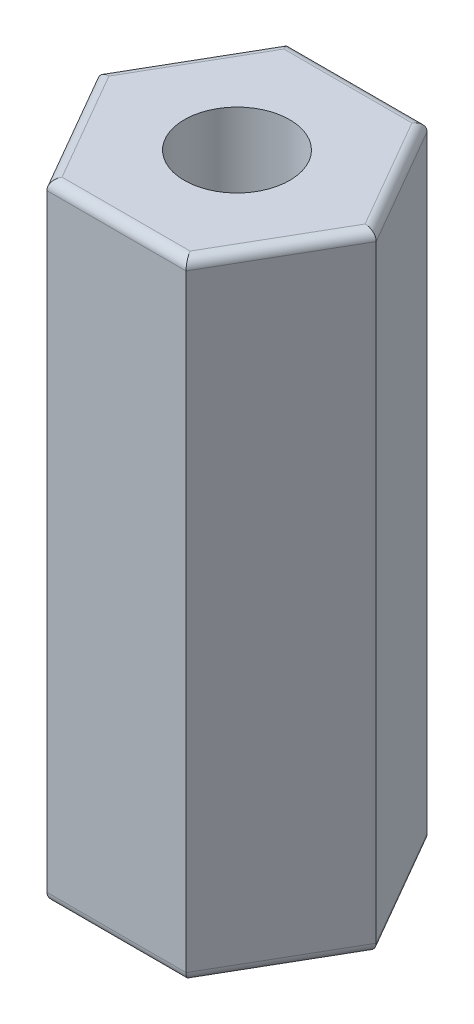
ISO-10303-21;
HEADER;
FILE_DESCRIPTION(('STEP AP214'),'2;1');
FILE_NAME('part.step','',(''),(''),'','','');
FILE_SCHEMA(('AUTOMOTIVE_DESIGN { 1 0 10303 214 1 1 1 1 }'));
ENDSEC;
DATA;
#1=APPLICATION_CONTEXT('core data for automotive mechanical design processes');
#2=APPLICATION_PROTOCOL_DEFINITION('international standard','automotive_design',2000,#1);
#3=PRODUCT_CONTEXT('',#1,'mechanical');
#4=PRODUCT('Part','Part','',(#3));
#5=PRODUCT_RELATED_PRODUCT_CATEGORY('part','',(#4));
#6=PRODUCT_DEFINITION_FORMATION('','',#4);
#7=PRODUCT_DEFINITION_CONTEXT('part definition',#1,'design');
#8=PRODUCT_DEFINITION('design','',#6,#7);
#9=PRODUCT_DEFINITION_SHAPE('','',#8);
#10=(LENGTH_UNIT() NAMED_UNIT(*) SI_UNIT(.MILLI.,.METRE.));
#11=(NAMED_UNIT(*) PLANE_ANGLE_UNIT() SI_UNIT($,.RADIAN.));
#12=(NAMED_UNIT(*) SI_UNIT($,.STERADIAN.) SOLID_ANGLE_UNIT());
#13=UNCERTAINTY_MEASURE_WITH_UNIT(LENGTH_MEASURE(1.E-05),#10,'distance_accuracy_value','');
#14=(GEOMETRIC_REPRESENTATION_CONTEXT(3) GLOBAL_UNCERTAINTY_ASSIGNED_CONTEXT((#13)) GLOBAL_UNIT_ASSIGNED_CONTEXT((#10,
#11,#12)) REPRESENTATION_CONTEXT('',''));
#15=CARTESIAN_POINT('',(0.,0.,0.));
#16=DIRECTION('',(0.,0.,1.));
#17=DIRECTION('',(1.,0.,0.));
#18=AXIS2_PLACEMENT_3D('',#15,#16,#17);
#19=CARTESIAN_POINT('',(1.44337567297406,13.,2.5));
#20=DIRECTION('',(-0.866025403784439,0.,-0.5));
#21=DIRECTION('',(-0.5,0.,0.866025403784439));
#22=AXIS2_PLACEMENT_3D('',#19,#20,#21);
#23=PLANE('',#22);
#24=DIRECTION('',(0.,-1.,0.));
#25=VECTOR('',#24,1.);
#26=CARTESIAN_POINT('',(2.88675134594813,13.,0.));
#27=LINE('',#26,#25);
#28=CARTESIAN_POINT('',(2.88675134594813,12.8,0.));
#29=VERTEX_POINT('',#28);
#30=CARTESIAN_POINT('',(2.88675134594813,0.199999999999999,0.));
#31=VERTEX_POINT('',#30);
#32=EDGE_CURVE('E149',#29,#31,#27,.T.);
#33=ORIENTED_EDGE('',*,*,#32,.F.);
#34=DIRECTION('',(0.5,0.,-0.866025403784439));
#35=VECTOR('',#34,1.);
#36=CARTESIAN_POINT('',(1.44337567297406,12.8,2.5));
#37=LINE('',#36,#35);
#38=CARTESIAN_POINT('',(1.44337567297406,12.8,2.5));
#39=VERTEX_POINT('',#38);
#40=EDGE_CURVE('E140',#29,#39,#37,.F.);
#41=ORIENTED_EDGE('',*,*,#40,.T.);
#42=DIRECTION('',(0.,-1.,0.));
#43=VECTOR('',#42,1.);
#44=CARTESIAN_POINT('',(1.44337567297406,13.,2.5));
#45=LINE('',#44,#43);
#46=CARTESIAN_POINT('',(1.44337567297406,0.200000000000001,2.5));
#47=VERTEX_POINT('',#46);
#48=EDGE_CURVE('E206',#39,#47,#45,.T.);
#49=ORIENTED_EDGE('',*,*,#48,.T.);
#50=DIRECTION('',(0.5,0.,-0.866025403784439));
#51=VECTOR('',#50,1.);
#52=CARTESIAN_POINT('',(1.44337567297406,0.200000000000001,2.5));
#53=LINE('',#52,#51);
#54=EDGE_CURVE('E181',#47,#31,#53,.T.);
#55=ORIENTED_EDGE('',*,*,#54,.T.);
#56=EDGE_LOOP('',(#33,#41,#49,#55));
#57=FACE_BOUND('',#56,.T.);
#58=ADVANCED_FACE('F33',(#57),#23,.F.);
#59=CARTESIAN_POINT('',(2.88675134594813,13.,0.));
#60=DIRECTION('',(-0.866025403784439,0.,0.5));
#61=DIRECTION('',(0.5,0.,0.866025403784439));
#62=AXIS2_PLACEMENT_3D('',#59,#60,#61);
#63=PLANE('',#62);
#64=DIRECTION('',(0.,-1.,0.));
#65=VECTOR('',#64,1.);
#66=CARTESIAN_POINT('',(1.44337567297406,13.,-2.5));
#67=LINE('',#66,#65);
#68=CARTESIAN_POINT('',(1.44337567297406,12.8,-2.5));
#69=VERTEX_POINT('',#68);
#70=CARTESIAN_POINT('',(1.44337567297406,0.199999999999999,-2.5));
#71=VERTEX_POINT('',#70);
#72=EDGE_CURVE('E152',#69,#71,#67,.T.);
#73=ORIENTED_EDGE('',*,*,#72,.F.);
#74=DIRECTION('',(-0.5,0.,-0.866025403784439));
#75=VECTOR('',#74,1.);
#76=CARTESIAN_POINT('',(2.88675134594813,12.8,0.));
#77=LINE('',#76,#75);
#78=EDGE_CURVE('E186',#69,#29,#77,.F.);
#79=ORIENTED_EDGE('',*,*,#78,.T.);
#80=ORIENTED_EDGE('',*,*,#32,.T.);
#81=DIRECTION('',(-0.5,0.,-0.866025403784439));
#82=VECTOR('',#81,1.);
#83=CARTESIAN_POINT('',(2.88675134594813,0.200000000000001,0.));
#84=LINE('',#83,#82);
#85=EDGE_CURVE('E184',#31,#71,#84,.T.);
#86=ORIENTED_EDGE('',*,*,#85,.T.);
#87=EDGE_LOOP('',(#73,#79,#80,#86));
#88=FACE_BOUND('',#87,.T.);
#89=ADVANCED_FACE('F268',(#88),#63,.F.);
#90=CARTESIAN_POINT('',(1.44337567297406,13.,-2.5));
#91=DIRECTION('',(0.,0.,1.));
#92=DIRECTION('',(1.,0.,0.));
#93=AXIS2_PLACEMENT_3D('',#90,#91,#92);
#94=PLANE('',#93);
#95=DIRECTION('',(0.,-1.,0.));
#96=VECTOR('',#95,1.);
#97=CARTESIAN_POINT('',(-1.44337567297406,13.,-2.5));
#98=LINE('',#97,#96);
#99=CARTESIAN_POINT('',(-1.44337567297406,12.8,-2.5));
#100=VERTEX_POINT('',#99);
#101=CARTESIAN_POINT('',(-1.44337567297406,0.199999999999999,-2.5));
#102=VERTEX_POINT('',#101);
#103=EDGE_CURVE('E259',#100,#102,#98,.T.);
#104=ORIENTED_EDGE('',*,*,#103,.F.);
#105=DIRECTION('',(-1.,0.,0.));
#106=VECTOR('',#105,1.);
#107=CARTESIAN_POINT('',(1.44337567297406,12.8,-2.5));
#108=LINE('',#107,#106);
#109=EDGE_CURVE('E165',#100,#69,#108,.F.);
#110=ORIENTED_EDGE('',*,*,#109,.T.);
#111=ORIENTED_EDGE('',*,*,#72,.T.);
#112=DIRECTION('',(-1.,0.,0.));
#113=VECTOR('',#112,1.);
#114=CARTESIAN_POINT('',(1.44337567297406,0.200000000000001,-2.5));
#115=LINE('',#114,#113);
#116=EDGE_CURVE('E163',#71,#102,#115,.T.);
#117=ORIENTED_EDGE('',*,*,#116,.T.);
#118=EDGE_LOOP('',(#104,#110,#111,#117));
#119=FACE_BOUND('',#118,.T.);
#120=ADVANCED_FACE('F265',(#119),#94,.F.);
#121=CARTESIAN_POINT('',(-1.44337567297406,13.,-2.5));
#122=DIRECTION('',(0.866025403784439,0.,0.5));
#123=DIRECTION('',(0.5,0.,-0.866025403784439));
#124=AXIS2_PLACEMENT_3D('',#121,#122,#123);
#125=PLANE('',#124);
#126=DIRECTION('',(0.,-1.,0.));
#127=VECTOR('',#126,1.);
#128=CARTESIAN_POINT('',(-2.88675134594813,13.,0.));
#129=LINE('',#128,#127);
#130=CARTESIAN_POINT('',(-2.88675134594813,12.8,0.));
#131=VERTEX_POINT('',#130);
#132=CARTESIAN_POINT('',(-2.88675134594813,0.199999999999999,0.));
#133=VERTEX_POINT('',#132);
#134=EDGE_CURVE('E251',#131,#133,#129,.T.);
#135=ORIENTED_EDGE('',*,*,#134,.F.);
#136=DIRECTION('',(-0.5,0.,0.866025403784439));
#137=VECTOR('',#136,1.);
#138=CARTESIAN_POINT('',(-1.44337567297406,12.8,-2.5));
#139=LINE('',#138,#137);
#140=EDGE_CURVE('E170',#131,#100,#139,.F.);
#141=ORIENTED_EDGE('',*,*,#140,.T.);
#142=ORIENTED_EDGE('',*,*,#103,.T.);
#143=DIRECTION('',(-0.5,0.,0.866025403784439));
#144=VECTOR('',#143,1.);
#145=CARTESIAN_POINT('',(-1.44337567297406,0.200000000000001,-2.5));
#146=LINE('',#145,#144);
#147=EDGE_CURVE('E168',#102,#133,#146,.T.);
#148=ORIENTED_EDGE('',*,*,#147,.T.);
#149=EDGE_LOOP('',(#135,#141,#142,#148));
#150=FACE_BOUND('',#149,.T.);
#151=ADVANCED_FACE('F275',(#150),#125,.F.);
#152=CARTESIAN_POINT('',(-2.88675134594813,13.,0.));
#153=DIRECTION('',(0.866025403784439,0.,-0.5));
#154=DIRECTION('',(-0.5,0.,-0.866025403784439));
#155=AXIS2_PLACEMENT_3D('',#152,#153,#154);
#156=PLANE('',#155);
#157=DIRECTION('',(0.,-1.,0.));
#158=VECTOR('',#157,1.);
#159=CARTESIAN_POINT('',(-1.44337567297406,13.,2.5));
#160=LINE('',#159,#158);
#161=CARTESIAN_POINT('',(-1.44337567297406,12.8,2.5));
#162=VERTEX_POINT('',#161);
#163=CARTESIAN_POINT('',(-1.44337567297406,0.199999999999999,2.5));
#164=VERTEX_POINT('',#163);
#165=EDGE_CURVE('E247',#162,#164,#160,.T.);
#166=ORIENTED_EDGE('',*,*,#165,.F.);
#167=DIRECTION('',(0.5,0.,0.866025403784439));
#168=VECTOR('',#167,1.);
#169=CARTESIAN_POINT('',(-2.88675134594813,12.8,0.));
#170=LINE('',#169,#168);
#171=EDGE_CURVE('E174',#162,#131,#170,.F.);
#172=ORIENTED_EDGE('',*,*,#171,.T.);
#173=ORIENTED_EDGE('',*,*,#134,.T.);
#174=DIRECTION('',(0.5,0.,0.866025403784439));
#175=VECTOR('',#174,1.);
#176=CARTESIAN_POINT('',(-2.88675134594813,0.200000000000001,0.));
#177=LINE('',#176,#175);
#178=EDGE_CURVE('E172',#133,#164,#177,.T.);
#179=ORIENTED_EDGE('',*,*,#178,.T.);
#180=EDGE_LOOP('',(#166,#172,#173,#179));
#181=FACE_BOUND('',#180,.T.);
#182=ADVANCED_FACE('F364',(#181),#156,.F.);
#183=CARTESIAN_POINT('',(-1.44337567297406,13.,2.5));
#184=DIRECTION('',(0.,0.,-1.));
#185=DIRECTION('',(-1.,0.,0.));
#186=AXIS2_PLACEMENT_3D('',#183,#184,#185);
#187=PLANE('',#186);
#188=ORIENTED_EDGE('',*,*,#48,.F.);
#189=DIRECTION('',(1.,0.,0.));
#190=VECTOR('',#189,1.);
#191=CARTESIAN_POINT('',(-1.44337567297406,12.8,2.5));
#192=LINE('',#191,#190);
#193=EDGE_CURVE('E179',#39,#162,#192,.F.);
#194=ORIENTED_EDGE('',*,*,#193,.T.);
#195=ORIENTED_EDGE('',*,*,#165,.T.);
#196=DIRECTION('',(1.,0.,0.));
#197=VECTOR('',#196,1.);
#198=CARTESIAN_POINT('',(-1.44337567297406,0.200000000000001,2.5));
#199=LINE('',#198,#197);
#200=EDGE_CURVE('E176',#164,#47,#199,.T.);
#201=ORIENTED_EDGE('',*,*,#200,.T.);
#202=EDGE_LOOP('',(#188,#194,#195,#201));
#203=FACE_BOUND('',#202,.T.);
#204=ADVANCED_FACE('F244',(#203),#187,.F.);
#205=CARTESIAN_POINT('',(2.88675134594813,13.,0.));
#206=DIRECTION('',(0.,1.,0.));
#207=DIRECTION('',(0.,0.,1.));
#208=AXIS2_PLACEMENT_3D('',#205,#206,#207);
#209=PLANE('',#208);
#210=CARTESIAN_POINT('',(0.,13.,0.));
#211=DIRECTION('',(0.,1.,0.));
#212=DIRECTION('',(0.,0.,1.));
#213=AXIS2_PLACEMENT_3D('',#210,#211,#212);
#214=CIRCLE('',#213,1.0922);
#215=CARTESIAN_POINT('',(0.,13.,1.0922));
#216=VERTEX_POINT('',#215);
#217=EDGE_CURVE('E254',#216,#216,#214,.T.);
#218=ORIENTED_EDGE('',*,*,#217,.F.);
#219=EDGE_LOOP('',(#218));
#220=FACE_BOUND('',#219,.T.);
#221=DIRECTION('',(-0.5,0.,-0.866025403784439));
#222=VECTOR('',#221,1.);
#223=CARTESIAN_POINT('',(1.27017059221718,13.,-2.4));
#224=LINE('',#223,#222);
#225=CARTESIAN_POINT('',(2.65581123827228,13.,0.));
#226=VERTEX_POINT('',#225);
#227=CARTESIAN_POINT('',(1.32790561913614,13.,-2.3));
#228=VERTEX_POINT('',#227);
#229=EDGE_CURVE('E128',#226,#228,#224,.T.);
#230=ORIENTED_EDGE('',*,*,#229,.T.);
#231=DIRECTION('',(-1.,0.,0.));
#232=VECTOR('',#231,1.);
#233=CARTESIAN_POINT('',(-1.44337567297406,13.,-2.3));
#234=LINE('',#233,#232);
#235=CARTESIAN_POINT('',(-1.32790561913614,13.,-2.3));
#236=VERTEX_POINT('',#235);
#237=EDGE_CURVE('E161',#228,#236,#234,.T.);
#238=ORIENTED_EDGE('',*,*,#237,.T.);
#239=DIRECTION('',(-0.5,0.,0.866025403784439));
#240=VECTOR('',#239,1.);
#241=CARTESIAN_POINT('',(-2.71354626519124,13.,0.100000000000001));
#242=LINE('',#241,#240);
#243=CARTESIAN_POINT('',(-2.65581123827228,13.,0.));
#244=VERTEX_POINT('',#243);
#245=EDGE_CURVE('E159',#236,#244,#242,.T.);
#246=ORIENTED_EDGE('',*,*,#245,.T.);
#247=DIRECTION('',(0.5,0.,0.866025403784439));
#248=VECTOR('',#247,1.);
#249=CARTESIAN_POINT('',(-1.27017059221718,13.,2.4));
#250=LINE('',#249,#248);
#251=CARTESIAN_POINT('',(-1.32790561913614,13.,2.3));
#252=VERTEX_POINT('',#251);
#253=EDGE_CURVE('E157',#244,#252,#250,.T.);
#254=ORIENTED_EDGE('',*,*,#253,.T.);
#255=DIRECTION('',(1.,0.,0.));
#256=VECTOR('',#255,1.);
#257=CARTESIAN_POINT('',(1.44337567297406,13.,2.3));
#258=LINE('',#257,#256);
#259=CARTESIAN_POINT('',(1.32790561913614,13.,2.3));
#260=VERTEX_POINT('',#259);
#261=EDGE_CURVE('E131',#252,#260,#258,.T.);
#262=ORIENTED_EDGE('',*,*,#261,.T.);
#263=DIRECTION('',(0.5,0.,-0.866025403784439));
#264=VECTOR('',#263,1.);
#265=CARTESIAN_POINT('',(2.71354626519124,13.,-0.100000000000001));
#266=LINE('',#265,#264);
#267=EDGE_CURVE('E123',#260,#226,#266,.T.);
#268=ORIENTED_EDGE('',*,*,#267,.T.);
#269=EDGE_LOOP('',(#230,#238,#246,#254,#262,#268));
#270=FACE_BOUND('',#269,.T.);
#271=ADVANCED_FACE('F125',(#220,#270),#209,.T.);
#272=CARTESIAN_POINT('',(2.88675134594813,0.,0.));
#273=DIRECTION('',(0.,1.,0.));
#274=DIRECTION('',(0.,0.,1.));
#275=AXIS2_PLACEMENT_3D('',#272,#273,#274);
#276=PLANE('',#275);
#277=CARTESIAN_POINT('',(0.,0.,0.));
#278=DIRECTION('',(0.,-1.,0.));
#279=DIRECTION('',(0.,0.,-1.));
#280=AXIS2_PLACEMENT_3D('',#277,#278,#279);
#281=CIRCLE('',#280,1.0922);
#282=CARTESIAN_POINT('',(0.,0.,-1.0922));
#283=VERTEX_POINT('',#282);
#284=EDGE_CURVE('E486',#283,#283,#281,.T.);
#285=ORIENTED_EDGE('',*,*,#284,.F.);
#286=EDGE_LOOP('',(#285));
#287=FACE_BOUND('',#286,.T.);
#288=DIRECTION('',(0.5,0.,-0.866025403784439));
#289=VECTOR('',#288,1.);
#290=CARTESIAN_POINT('',(2.71354626519124,0.,-0.100000000000001));
#291=LINE('',#290,#289);
#292=CARTESIAN_POINT('',(2.65581123827228,0.,0.));
#293=VERTEX_POINT('',#292);
#294=CARTESIAN_POINT('',(1.32790561913614,0.,2.3));
#295=VERTEX_POINT('',#294);
#296=EDGE_CURVE('E188',#293,#295,#291,.F.);
#297=ORIENTED_EDGE('',*,*,#296,.T.);
#298=DIRECTION('',(1.,0.,0.));
#299=VECTOR('',#298,1.);
#300=CARTESIAN_POINT('',(2.88675134594813,0.,2.3));
#301=LINE('',#300,#299);
#302=CARTESIAN_POINT('',(-1.32790561913614,0.,2.3));
#303=VERTEX_POINT('',#302);
#304=EDGE_CURVE('E11',#295,#303,#301,.F.);
#305=ORIENTED_EDGE('',*,*,#304,.T.);
#306=DIRECTION('',(0.5,0.,0.866025403784439));
#307=VECTOR('',#306,1.);
#308=CARTESIAN_POINT('',(-1.27017059221718,0.,2.4));
#309=LINE('',#308,#307);
#310=CARTESIAN_POINT('',(-2.65581123827228,0.,0.));
#311=VERTEX_POINT('',#310);
#312=EDGE_CURVE('E42',#303,#311,#309,.F.);
#313=ORIENTED_EDGE('',*,*,#312,.T.);
#314=DIRECTION('',(-0.5,0.,0.866025403784439));
#315=VECTOR('',#314,1.);
#316=CARTESIAN_POINT('',(-1.27017059221718,0.,-2.4));
#317=LINE('',#316,#315);
#318=CARTESIAN_POINT('',(-1.32790561913614,0.,-2.3));
#319=VERTEX_POINT('',#318);
#320=EDGE_CURVE('E194',#311,#319,#317,.F.);
#321=ORIENTED_EDGE('',*,*,#320,.T.);
#322=DIRECTION('',(-1.,0.,0.));
#323=VECTOR('',#322,1.);
#324=CARTESIAN_POINT('',(2.88675134594813,0.,-2.3));
#325=LINE('',#324,#323);
#326=CARTESIAN_POINT('',(1.32790561913614,0.,-2.3));
#327=VERTEX_POINT('',#326);
#328=EDGE_CURVE('E192',#319,#327,#325,.F.);
#329=ORIENTED_EDGE('',*,*,#328,.T.);
#330=DIRECTION('',(-0.5,0.,-0.866025403784439));
#331=VECTOR('',#330,1.);
#332=CARTESIAN_POINT('',(2.71354626519124,0.,0.0999999999999995));
#333=LINE('',#332,#331);
#334=EDGE_CURVE('E190',#327,#293,#333,.F.);
#335=ORIENTED_EDGE('',*,*,#334,.T.);
#336=EDGE_LOOP('',(#297,#305,#313,#321,#329,#335));
#337=FACE_BOUND('',#336,.T.);
#338=ADVANCED_FACE('F231',(#287,#337),#276,.F.);
#339=CARTESIAN_POINT('',(2.88675134594813,12.8,2.3));
#340=DIRECTION('',(-1.,0.,0.));
#341=DIRECTION('',(0.,0.,1.));
#342=AXIS2_PLACEMENT_3D('',#339,#340,#341);
#343=CYLINDRICAL_SURFACE('',#342,0.2);
#344=CARTESIAN_POINT('',(-1.32790561913614,12.8,2.3));
#345=DIRECTION('',(-0.866025403784439,0.,-0.5));
#346=DIRECTION('',(-0.5,0.,0.866025403784439));
#347=AXIS2_PLACEMENT_3D('',#344,#345,#346);
#348=ELLIPSE('',#347,0.23094010767585,0.2);
#349=EDGE_CURVE('E143',#162,#252,#348,.T.);
#350=ORIENTED_EDGE('',*,*,#349,.F.);
#351=ORIENTED_EDGE('',*,*,#193,.F.);
#352=CARTESIAN_POINT('',(1.32790561913614,12.8,2.3));
#353=DIRECTION('',(-0.866025403784438,0.,0.5));
#354=DIRECTION('',(0.5,0.,0.866025403784439));
#355=AXIS2_PLACEMENT_3D('',#352,#353,#354);
#356=ELLIPSE('',#355,0.23094010767585,0.2);
#357=EDGE_CURVE('E204',#260,#39,#356,.F.);
#358=ORIENTED_EDGE('',*,*,#357,.F.);
#359=ORIENTED_EDGE('',*,*,#261,.F.);
#360=EDGE_LOOP('',(#350,#351,#358,#359));
#361=FACE_BOUND('',#360,.T.);
#362=ADVANCED_FACE('F296',(#361),#343,.T.);
#363=CARTESIAN_POINT('',(2.71354626519124,12.8,-0.100000000000001));
#364=DIRECTION('',(-0.5,0.,0.866025403784439));
#365=DIRECTION('',(0.866025403784439,0.,0.5));
#366=AXIS2_PLACEMENT_3D('',#363,#364,#365);
#367=CYLINDRICAL_SURFACE('',#366,0.2);
#368=ORIENTED_EDGE('',*,*,#357,.T.);
#369=ORIENTED_EDGE('',*,*,#40,.F.);
#370=CARTESIAN_POINT('',(2.65581123827228,12.8,0.));
#371=DIRECTION('',(0.,0.,1.));
#372=DIRECTION('',(1.,0.,0.));
#373=AXIS2_PLACEMENT_3D('',#370,#371,#372);
#374=ELLIPSE('',#373,0.23094010767585,0.2);
#375=EDGE_CURVE('E138',#226,#29,#374,.F.);
#376=ORIENTED_EDGE('',*,*,#375,.F.);
#377=ORIENTED_EDGE('',*,*,#267,.F.);
#378=EDGE_LOOP('',(#368,#369,#376,#377));
#379=FACE_BOUND('',#378,.T.);
#380=ADVANCED_FACE('F139',(#379),#367,.T.);
#381=CARTESIAN_POINT('',(-1.27017059221718,12.8,2.4));
#382=DIRECTION('',(-0.5,0.,-0.866025403784439));
#383=DIRECTION('',(-0.866025403784439,0.,0.5));
#384=AXIS2_PLACEMENT_3D('',#381,#382,#383);
#385=CYLINDRICAL_SURFACE('',#384,0.2);
#386=ORIENTED_EDGE('',*,*,#349,.T.);
#387=ORIENTED_EDGE('',*,*,#253,.F.);
#388=CARTESIAN_POINT('',(-2.65581123827228,12.8,0.));
#389=DIRECTION('',(0.,0.,-1.));
#390=DIRECTION('',(-1.,0.,0.));
#391=AXIS2_PLACEMENT_3D('',#388,#389,#390);
#392=ELLIPSE('',#391,0.23094010767585,0.2);
#393=EDGE_CURVE('E144',#131,#244,#392,.T.);
#394=ORIENTED_EDGE('',*,*,#393,.F.);
#395=ORIENTED_EDGE('',*,*,#171,.F.);
#396=EDGE_LOOP('',(#386,#387,#394,#395));
#397=FACE_BOUND('',#396,.T.);
#398=ADVANCED_FACE('F290',(#397),#385,.T.);
#399=CARTESIAN_POINT('',(2.71354626519124,12.8,0.0999999999999994));
#400=DIRECTION('',(0.5,0.,0.866025403784439));
#401=DIRECTION('',(0.866025403784439,0.,-0.5));
#402=AXIS2_PLACEMENT_3D('',#399,#400,#401);
#403=CYLINDRICAL_SURFACE('',#402,0.2);
#404=ORIENTED_EDGE('',*,*,#375,.T.);
#405=ORIENTED_EDGE('',*,*,#78,.F.);
#406=CARTESIAN_POINT('',(1.32790561913614,12.8,-2.3));
#407=DIRECTION('',(0.866025403784439,0.,0.5));
#408=DIRECTION('',(-0.5,0.,0.866025403784439));
#409=AXIS2_PLACEMENT_3D('',#406,#407,#408);
#410=ELLIPSE('',#409,0.23094010767585,0.2);
#411=EDGE_CURVE('E147',#228,#69,#410,.F.);
#412=ORIENTED_EDGE('',*,*,#411,.F.);
#413=ORIENTED_EDGE('',*,*,#229,.F.);
#414=EDGE_LOOP('',(#404,#405,#412,#413));
#415=FACE_BOUND('',#414,.T.);
#416=ADVANCED_FACE('F146',(#415),#403,.T.);
#417=CARTESIAN_POINT('',(-1.27017059221718,12.8,-2.4));
#418=DIRECTION('',(0.5,0.,-0.866025403784439));
#419=DIRECTION('',(-0.866025403784439,0.,-0.5));
#420=AXIS2_PLACEMENT_3D('',#417,#418,#419);
#421=CYLINDRICAL_SURFACE('',#420,0.2);
#422=ORIENTED_EDGE('',*,*,#393,.T.);
#423=ORIENTED_EDGE('',*,*,#245,.F.);
#424=CARTESIAN_POINT('',(-1.32790561913614,12.8,-2.3));
#425=DIRECTION('',(0.866025403784439,0.,-0.5));
#426=DIRECTION('',(-0.5,0.,-0.866025403784439));
#427=AXIS2_PLACEMENT_3D('',#424,#425,#426);
#428=ELLIPSE('',#427,0.23094010767585,0.2);
#429=EDGE_CURVE('E197',#100,#236,#428,.T.);
#430=ORIENTED_EDGE('',*,*,#429,.F.);
#431=ORIENTED_EDGE('',*,*,#140,.F.);
#432=EDGE_LOOP('',(#422,#423,#430,#431));
#433=FACE_BOUND('',#432,.T.);
#434=ADVANCED_FACE('F283',(#433),#421,.T.);
#435=CARTESIAN_POINT('',(2.88675134594813,12.8,-2.3));
#436=DIRECTION('',(1.,0.,0.));
#437=DIRECTION('',(0.,0.,-1.));
#438=AXIS2_PLACEMENT_3D('',#435,#436,#437);
#439=CYLINDRICAL_SURFACE('',#438,0.2);
#440=ORIENTED_EDGE('',*,*,#411,.T.);
#441=ORIENTED_EDGE('',*,*,#109,.F.);
#442=ORIENTED_EDGE('',*,*,#429,.T.);
#443=ORIENTED_EDGE('',*,*,#237,.F.);
#444=EDGE_LOOP('',(#440,#441,#442,#443));
#445=FACE_BOUND('',#444,.T.);
#446=ADVANCED_FACE('F280',(#445),#439,.T.);
#447=CARTESIAN_POINT('',(1.44337567297406,0.200000000000001,-2.3));
#448=DIRECTION('',(-1.,0.,0.));
#449=DIRECTION('',(0.,0.,1.));
#450=AXIS2_PLACEMENT_3D('',#447,#448,#449);
#451=CYLINDRICAL_SURFACE('',#450,0.2);
#452=CARTESIAN_POINT('',(1.32790561913614,0.200000000000001,-2.3));
#453=DIRECTION('',(-0.866025403784439,0.,-0.5));
#454=DIRECTION('',(0.5,0.,-0.866025403784439));
#455=AXIS2_PLACEMENT_3D('',#452,#453,#454);
#456=ELLIPSE('',#455,0.23094010767585,0.2);
#457=EDGE_CURVE('E216',#327,#71,#456,.F.);
#458=ORIENTED_EDGE('',*,*,#457,.F.);
#459=ORIENTED_EDGE('',*,*,#328,.F.);
#460=CARTESIAN_POINT('',(-1.32790561913614,0.200000000000001,-2.3));
#461=DIRECTION('',(-0.866025403784439,0.,0.5));
#462=DIRECTION('',(-0.5,0.,-0.866025403784439));
#463=AXIS2_PLACEMENT_3D('',#460,#461,#462);
#464=ELLIPSE('',#463,0.23094010767585,0.2);
#465=EDGE_CURVE('E37',#102,#319,#464,.T.);
#466=ORIENTED_EDGE('',*,*,#465,.F.);
#467=ORIENTED_EDGE('',*,*,#116,.F.);
#468=EDGE_LOOP('',(#458,#459,#466,#467));
#469=FACE_BOUND('',#468,.T.);
#470=ADVANCED_FACE('F35',(#469),#451,.T.);
#471=CARTESIAN_POINT('',(-1.27017059221718,0.200000000000001,-2.4));
#472=DIRECTION('',(-0.5,0.,0.866025403784439));
#473=DIRECTION('',(0.866025403784439,0.,0.5));
#474=AXIS2_PLACEMENT_3D('',#471,#472,#473);
#475=CYLINDRICAL_SURFACE('',#474,0.2);
#476=ORIENTED_EDGE('',*,*,#465,.T.);
#477=ORIENTED_EDGE('',*,*,#320,.F.);
#478=CARTESIAN_POINT('',(-2.65581123827228,0.200000000000001,0.));
#479=DIRECTION('',(0.,0.,1.));
#480=DIRECTION('',(-1.,0.,0.));
#481=AXIS2_PLACEMENT_3D('',#478,#479,#480);
#482=ELLIPSE('',#481,0.23094010767585,0.2);
#483=EDGE_CURVE('E214',#133,#311,#482,.T.);
#484=ORIENTED_EDGE('',*,*,#483,.F.);
#485=ORIENTED_EDGE('',*,*,#147,.F.);
#486=EDGE_LOOP('',(#476,#477,#484,#485));
#487=FACE_BOUND('',#486,.T.);
#488=ADVANCED_FACE('F226',(#487),#475,.T.);
#489=CARTESIAN_POINT('',(2.71354626519124,0.200000000000001,0.0999999999999992));
#490=DIRECTION('',(-0.5,0.,-0.866025403784439));
#491=DIRECTION('',(-0.866025403784439,0.,0.5));
#492=AXIS2_PLACEMENT_3D('',#489,#490,#491);
#493=CYLINDRICAL_SURFACE('',#492,0.2);
#494=ORIENTED_EDGE('',*,*,#457,.T.);
#495=ORIENTED_EDGE('',*,*,#85,.F.);
#496=CARTESIAN_POINT('',(2.65581123827228,0.200000000000001,0.));
#497=DIRECTION('',(0.,0.,-1.));
#498=DIRECTION('',(1.,0.,0.));
#499=AXIS2_PLACEMENT_3D('',#496,#497,#498);
#500=ELLIPSE('',#499,0.23094010767585,0.2);
#501=EDGE_CURVE('E211',#293,#31,#500,.F.);
#502=ORIENTED_EDGE('',*,*,#501,.F.);
#503=ORIENTED_EDGE('',*,*,#334,.F.);
#504=EDGE_LOOP('',(#494,#495,#502,#503));
#505=FACE_BOUND('',#504,.T.);
#506=ADVANCED_FACE('F234',(#505),#493,.T.);
#507=CARTESIAN_POINT('',(-2.71354626519124,0.200000000000001,-0.0999999999999996));
#508=DIRECTION('',(0.5,0.,0.866025403784439));
#509=DIRECTION('',(0.866025403784439,0.,-0.5));
#510=AXIS2_PLACEMENT_3D('',#507,#508,#509);
#511=CYLINDRICAL_SURFACE('',#510,0.2);
#512=ORIENTED_EDGE('',*,*,#483,.T.);
#513=ORIENTED_EDGE('',*,*,#312,.F.);
#514=CARTESIAN_POINT('',(-1.32790561913614,0.200000000000001,2.3));
#515=DIRECTION('',(0.866025403784439,0.,0.5));
#516=DIRECTION('',(-0.5,0.,0.866025403784439));
#517=AXIS2_PLACEMENT_3D('',#514,#515,#516);
#518=ELLIPSE('',#517,0.23094010767585,0.2);
#519=EDGE_CURVE('E50',#164,#303,#518,.T.);
#520=ORIENTED_EDGE('',*,*,#519,.F.);
#521=ORIENTED_EDGE('',*,*,#178,.F.);
#522=EDGE_LOOP('',(#512,#513,#520,#521));
#523=FACE_BOUND('',#522,.T.);
#524=ADVANCED_FACE('F305',(#523),#511,.T.);
#525=CARTESIAN_POINT('',(1.27017059221718,0.200000000000001,2.4));
#526=DIRECTION('',(0.5,0.,-0.866025403784439));
#527=DIRECTION('',(-0.866025403784439,0.,-0.5));
#528=AXIS2_PLACEMENT_3D('',#525,#526,#527);
#529=CYLINDRICAL_SURFACE('',#528,0.2);
#530=ORIENTED_EDGE('',*,*,#501,.T.);
#531=ORIENTED_EDGE('',*,*,#54,.F.);
#532=CARTESIAN_POINT('',(1.32790561913614,0.200000000000001,2.3));
#533=DIRECTION('',(0.866025403784438,0.,-0.5));
#534=DIRECTION('',(-0.5,0.,-0.866025403784439));
#535=AXIS2_PLACEMENT_3D('',#532,#533,#534);
#536=ELLIPSE('',#535,0.23094010767585,0.2);
#537=EDGE_CURVE('E207',#295,#47,#536,.F.);
#538=ORIENTED_EDGE('',*,*,#537,.F.);
#539=ORIENTED_EDGE('',*,*,#296,.F.);
#540=EDGE_LOOP('',(#530,#531,#538,#539));
#541=FACE_BOUND('',#540,.T.);
#542=ADVANCED_FACE('F238',(#541),#529,.T.);
#543=CARTESIAN_POINT('',(-1.44337567297406,0.200000000000001,2.3));
#544=DIRECTION('',(1.,0.,0.));
#545=DIRECTION('',(0.,0.,-1.));
#546=AXIS2_PLACEMENT_3D('',#543,#544,#545);
#547=CYLINDRICAL_SURFACE('',#546,0.2);
#548=ORIENTED_EDGE('',*,*,#519,.T.);
#549=ORIENTED_EDGE('',*,*,#304,.F.);
#550=ORIENTED_EDGE('',*,*,#537,.T.);
#551=ORIENTED_EDGE('',*,*,#200,.F.);
#552=EDGE_LOOP('',(#548,#549,#550,#551));
#553=FACE_BOUND('',#552,.T.);
#554=ADVANCED_FACE('F239',(#553),#547,.T.);
#555=CARTESIAN_POINT('',(0.,8.,0.));
#556=DIRECTION('',(0.,1.,0.));
#557=DIRECTION('',(0.,0.,1.));
#558=AXIS2_PLACEMENT_3D('',#555,#556,#557);
#559=CYLINDRICAL_SURFACE('',#558,1.0922);
#560=CARTESIAN_POINT('',(0.,8.,0.));
#561=DIRECTION('',(0.,1.,0.));
#562=DIRECTION('',(0.,0.,1.));
#563=AXIS2_PLACEMENT_3D('',#560,#561,#562);
#564=CIRCLE('',#563,1.0922);
#565=CARTESIAN_POINT('',(0.,8.,1.0922));
#566=VERTEX_POINT('',#565);
#567=EDGE_CURVE('E209',#566,#566,#564,.T.);
#568=ORIENTED_EDGE('',*,*,#567,.F.);
#569=EDGE_LOOP('',(#568));
#570=FACE_BOUND('',#569,.T.);
#571=ORIENTED_EDGE('',*,*,#217,.T.);
#572=EDGE_LOOP('',(#571));
#573=FACE_BOUND('',#572,.T.);
#574=ADVANCED_FACE('F302',(#570,#573),#559,.F.);
#575=CARTESIAN_POINT('',(0.,8.,0.));
#576=DIRECTION('',(0.,1.,0.));
#577=DIRECTION('',(0.,0.,1.));
#578=AXIS2_PLACEMENT_3D('',#575,#576,#577);
#579=PLANE('',#578);
#580=ORIENTED_EDGE('',*,*,#567,.T.);
#581=EDGE_LOOP('',(#580));
#582=FACE_BOUND('',#581,.T.);
#583=ADVANCED_FACE('F448',(#582),#579,.T.);
#584=CARTESIAN_POINT('',(0.,5.,0.));
#585=DIRECTION('',(0.,-1.,0.));
#586=DIRECTION('',(0.,0.,-1.));
#587=AXIS2_PLACEMENT_3D('',#584,#585,#586);
#588=CYLINDRICAL_SURFACE('',#587,1.0922);
#589=CARTESIAN_POINT('',(0.,5.,0.));
#590=DIRECTION('',(0.,-1.,0.));
#591=DIRECTION('',(0.,0.,-1.));
#592=AXIS2_PLACEMENT_3D('',#589,#590,#591);
#593=CIRCLE('',#592,1.0922);
#594=CARTESIAN_POINT('',(0.,5.,-1.0922));
#595=VERTEX_POINT('',#594);
#596=EDGE_CURVE('E485',#595,#595,#593,.T.);
#597=ORIENTED_EDGE('',*,*,#596,.F.);
#598=EDGE_LOOP('',(#597));
#599=FACE_BOUND('',#598,.T.);
#600=ORIENTED_EDGE('',*,*,#284,.T.);
#601=EDGE_LOOP('',(#600));
#602=FACE_BOUND('',#601,.T.);
#603=ADVANCED_FACE('F456',(#599,#602),#588,.F.);
#604=CARTESIAN_POINT('',(0.,5.,0.));
#605=DIRECTION('',(0.,-1.,0.));
#606=DIRECTION('',(0.,0.,-1.));
#607=AXIS2_PLACEMENT_3D('',#604,#605,#606);
#608=PLANE('',#607);
#609=ORIENTED_EDGE('',*,*,#596,.T.);
#610=EDGE_LOOP('',(#609));
#611=FACE_BOUND('',#610,.T.);
#612=ADVANCED_FACE('F464',(#611),#608,.T.);
#613=CLOSED_SHELL('',(#58,#89,#120,#151,#182,#204,#271,#338,#362,#380,#398,#416,#434,#446,#470,
#488,#506,#524,#542,#554,#574,#583,#603,#612));
#614=MANIFOLD_SOLID_BREP('B2',#613);
#615=ADVANCED_BREP_SHAPE_REPRESENTATION('',(#18,#614),#14);
#616=SHAPE_DEFINITION_REPRESENTATION(#9,#615);
ENDSEC;
END-ISO-10303-21;
